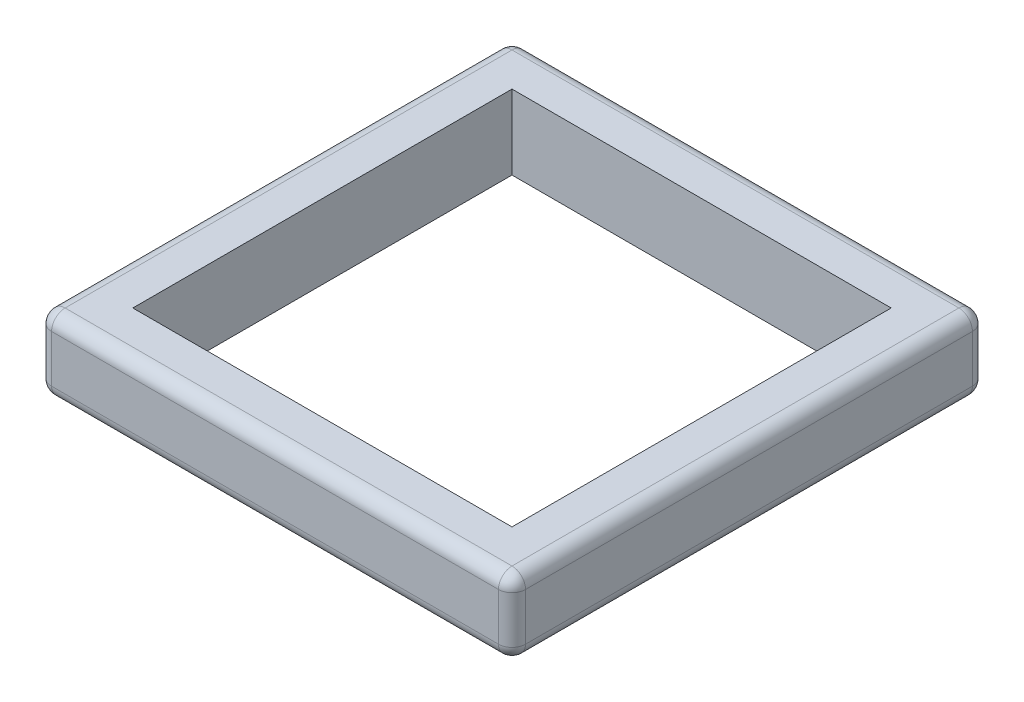
ISO-10303-21;
HEADER;
FILE_DESCRIPTION(('STEP AP214'),'2;1');
FILE_NAME('part.step','',(''),(''),'','','');
FILE_SCHEMA(('AUTOMOTIVE_DESIGN { 1 0 10303 214 1 1 1 1 }'));
ENDSEC;
DATA;
#1=APPLICATION_CONTEXT('core data for automotive mechanical design processes');
#2=APPLICATION_PROTOCOL_DEFINITION('international standard','automotive_design',2000,#1);
#3=PRODUCT_CONTEXT('',#1,'mechanical');
#4=PRODUCT('Part','Part','',(#3));
#5=PRODUCT_RELATED_PRODUCT_CATEGORY('part','',(#4));
#6=PRODUCT_DEFINITION_FORMATION('','',#4);
#7=PRODUCT_DEFINITION_CONTEXT('part definition',#1,'design');
#8=PRODUCT_DEFINITION('design','',#6,#7);
#9=PRODUCT_DEFINITION_SHAPE('','',#8);
#10=(LENGTH_UNIT() NAMED_UNIT(*) SI_UNIT(.MILLI.,.METRE.));
#11=(NAMED_UNIT(*) PLANE_ANGLE_UNIT() SI_UNIT($,.RADIAN.));
#12=(NAMED_UNIT(*) SI_UNIT($,.STERADIAN.) SOLID_ANGLE_UNIT());
#13=UNCERTAINTY_MEASURE_WITH_UNIT(LENGTH_MEASURE(1.E-05),#10,'distance_accuracy_value','');
#14=(GEOMETRIC_REPRESENTATION_CONTEXT(3) GLOBAL_UNCERTAINTY_ASSIGNED_CONTEXT((#13)) GLOBAL_UNIT_ASSIGNED_CONTEXT((#10,
#11,#12)) REPRESENTATION_CONTEXT('',''));
#15=CARTESIAN_POINT('',(0.,0.,0.));
#16=DIRECTION('',(0.,0.,1.));
#17=DIRECTION('',(1.,0.,0.));
#18=AXIS2_PLACEMENT_3D('',#15,#16,#17);
#19=CARTESIAN_POINT('',(0.,139.7,0.));
#20=DIRECTION('',(0.,-1.,0.));
#21=DIRECTION('',(0.,0.,-1.));
#22=AXIS2_PLACEMENT_3D('',#19,#20,#21);
#23=PLANE('',#22);
#24=DIRECTION('',(-1.,0.,0.));
#25=VECTOR('',#24,1.);
#26=CARTESIAN_POINT('',(0.,139.7,-397.944050632912));
#27=LINE('',#26,#25);
#28=CARTESIAN_POINT('',(380.389113924051,139.7,-397.944050632912));
#29=VERTEX_POINT('',#28);
#30=CARTESIAN_POINT('',(-457.810886075949,139.7,-397.944050632912));
#31=VERTEX_POINT('',#30);
#32=EDGE_CURVE('E53',#29,#31,#27,.T.);
#33=ORIENTED_EDGE('',*,*,#32,.T.);
#34=DIRECTION('',(0.,0.,1.));
#35=VECTOR('',#34,1.);
#36=CARTESIAN_POINT('',(-457.810886075949,139.7,0.));
#37=LINE('',#36,#35);
#38=CARTESIAN_POINT('',(-457.810886075949,139.7,440.255949367088));
#39=VERTEX_POINT('',#38);
#40=EDGE_CURVE('E11',#31,#39,#37,.T.);
#41=ORIENTED_EDGE('',*,*,#40,.T.);
#42=DIRECTION('',(1.,0.,0.));
#43=VECTOR('',#42,1.);
#44=CARTESIAN_POINT('',(0.,139.7,440.255949367088));
#45=LINE('',#44,#43);
#46=CARTESIAN_POINT('',(380.389113924051,139.7,440.255949367088));
#47=VERTEX_POINT('',#46);
#48=EDGE_CURVE('E274',#39,#47,#45,.T.);
#49=ORIENTED_EDGE('',*,*,#48,.T.);
#50=DIRECTION('',(0.,0.,-1.));
#51=VECTOR('',#50,1.);
#52=CARTESIAN_POINT('',(380.389113924051,139.7,0.));
#53=LINE('',#52,#51);
#54=EDGE_CURVE('E64',#47,#29,#53,.T.);
#55=ORIENTED_EDGE('',*,*,#54,.T.);
#56=EDGE_LOOP('',(#33,#41,#49,#55));
#57=FACE_BOUND('',#56,.T.);
#58=DIRECTION('',(0.,0.,-1.));
#59=VECTOR('',#58,1.);
#60=CARTESIAN_POINT('',(316.889113924051,139.7,376.755949367088));
#61=LINE('',#60,#59);
#62=CARTESIAN_POINT('',(316.889113924051,139.7,376.755949367088));
#63=VERTEX_POINT('',#62);
#64=CARTESIAN_POINT('',(316.889113924051,139.7,-334.444050632912));
#65=VERTEX_POINT('',#64);
#66=EDGE_CURVE('E157',#63,#65,#61,.T.);
#67=ORIENTED_EDGE('',*,*,#66,.F.);
#68=DIRECTION('',(1.,0.,0.));
#69=VECTOR('',#68,1.);
#70=CARTESIAN_POINT('',(-394.310886075949,139.7,376.755949367088));
#71=LINE('',#70,#69);
#72=CARTESIAN_POINT('',(-394.310886075949,139.7,376.755949367088));
#73=VERTEX_POINT('',#72);
#74=EDGE_CURVE('E186',#73,#63,#71,.T.);
#75=ORIENTED_EDGE('',*,*,#74,.F.);
#76=DIRECTION('',(0.,0.,1.));
#77=VECTOR('',#76,1.);
#78=CARTESIAN_POINT('',(-394.310886075949,139.7,376.755949367088));
#79=LINE('',#78,#77);
#80=CARTESIAN_POINT('',(-394.310886075949,139.7,-334.444050632912));
#81=VERTEX_POINT('',#80);
#82=EDGE_CURVE('E182',#81,#73,#79,.T.);
#83=ORIENTED_EDGE('',*,*,#82,.F.);
#84=DIRECTION('',(-1.,0.,0.));
#85=VECTOR('',#84,1.);
#86=CARTESIAN_POINT('',(-394.310886075949,139.7,-334.444050632912));
#87=LINE('',#86,#85);
#88=EDGE_CURVE('E168',#65,#81,#87,.T.);
#89=ORIENTED_EDGE('',*,*,#88,.F.);
#90=EDGE_LOOP('',(#67,#75,#83,#89));
#91=FACE_BOUND('',#90,.T.);
#92=ADVANCED_FACE('F43',(#57,#91),#23,.F.);
#93=CARTESIAN_POINT('',(0.,0.,0.));
#94=DIRECTION('',(0.,-1.,0.));
#95=DIRECTION('',(0.,0.,-1.));
#96=AXIS2_PLACEMENT_3D('',#93,#94,#95);
#97=PLANE('',#96);
#98=DIRECTION('',(1.,0.,0.));
#99=VECTOR('',#98,1.);
#100=CARTESIAN_POINT('',(-483.210886075949,0.,440.255949367088));
#101=LINE('',#100,#99);
#102=CARTESIAN_POINT('',(380.389113924051,0.,440.255949367088));
#103=VERTEX_POINT('',#102);
#104=CARTESIAN_POINT('',(-457.810886075949,0.,440.255949367088));
#105=VERTEX_POINT('',#104);
#106=EDGE_CURVE('E264',#103,#105,#101,.F.);
#107=ORIENTED_EDGE('',*,*,#106,.T.);
#108=DIRECTION('',(0.,0.,1.));
#109=VECTOR('',#108,1.);
#110=CARTESIAN_POINT('',(-457.810886075949,0.,-423.344050632912));
#111=LINE('',#110,#109);
#112=CARTESIAN_POINT('',(-457.810886075949,0.,-397.944050632912));
#113=VERTEX_POINT('',#112);
#114=EDGE_CURVE('E270',#105,#113,#111,.F.);
#115=ORIENTED_EDGE('',*,*,#114,.T.);
#116=DIRECTION('',(-1.,0.,0.));
#117=VECTOR('',#116,1.);
#118=CARTESIAN_POINT('',(405.789113924051,0.,-397.944050632912));
#119=LINE('',#118,#117);
#120=CARTESIAN_POINT('',(380.389113924051,0.,-397.944050632912));
#121=VERTEX_POINT('',#120);
#122=EDGE_CURVE('E267',#113,#121,#119,.F.);
#123=ORIENTED_EDGE('',*,*,#122,.T.);
#124=DIRECTION('',(0.,0.,-1.));
#125=VECTOR('',#124,1.);
#126=CARTESIAN_POINT('',(380.389113924051,0.,465.655949367088));
#127=LINE('',#126,#125);
#128=EDGE_CURVE('E261',#121,#103,#127,.F.);
#129=ORIENTED_EDGE('',*,*,#128,.T.);
#130=EDGE_LOOP('',(#107,#115,#123,#129));
#131=FACE_BOUND('',#130,.T.);
#132=DIRECTION('',(1.,0.,0.));
#133=VECTOR('',#132,1.);
#134=CARTESIAN_POINT('',(-394.310886075949,0.,376.755949367088));
#135=LINE('',#134,#133);
#136=CARTESIAN_POINT('',(-394.310886075949,0.,376.755949367088));
#137=VERTEX_POINT('',#136);
#138=CARTESIAN_POINT('',(316.889113924051,0.,376.755949367088));
#139=VERTEX_POINT('',#138);
#140=EDGE_CURVE('E169',#137,#139,#135,.T.);
#141=ORIENTED_EDGE('',*,*,#140,.T.);
#142=DIRECTION('',(0.,0.,-1.));
#143=VECTOR('',#142,1.);
#144=CARTESIAN_POINT('',(316.889113924051,0.,376.755949367088));
#145=LINE('',#144,#143);
#146=CARTESIAN_POINT('',(316.889113924051,0.,-334.444050632912));
#147=VERTEX_POINT('',#146);
#148=EDGE_CURVE('E191',#139,#147,#145,.T.);
#149=ORIENTED_EDGE('',*,*,#148,.T.);
#150=DIRECTION('',(-1.,0.,0.));
#151=VECTOR('',#150,1.);
#152=CARTESIAN_POINT('',(-394.310886075949,0.,-334.444050632912));
#153=LINE('',#152,#151);
#154=CARTESIAN_POINT('',(-394.310886075949,0.,-334.444050632912));
#155=VERTEX_POINT('',#154);
#156=EDGE_CURVE('E175',#147,#155,#153,.T.);
#157=ORIENTED_EDGE('',*,*,#156,.T.);
#158=DIRECTION('',(0.,0.,1.));
#159=VECTOR('',#158,1.);
#160=CARTESIAN_POINT('',(-394.310886075949,0.,376.755949367088));
#161=LINE('',#160,#159);
#162=EDGE_CURVE('E196',#155,#137,#161,.T.);
#163=ORIENTED_EDGE('',*,*,#162,.T.);
#164=EDGE_LOOP('',(#141,#149,#157,#163));
#165=FACE_BOUND('',#164,.T.);
#166=ADVANCED_FACE('F448',(#131,#165),#97,.T.);
#167=CARTESIAN_POINT('',(405.789113924051,139.7,465.655949367088));
#168=DIRECTION('',(-1.,0.,0.));
#169=DIRECTION('',(0.,0.,1.));
#170=AXIS2_PLACEMENT_3D('',#167,#168,#169);
#171=PLANE('',#170);
#172=DIRECTION('',(0.,-1.,0.));
#173=VECTOR('',#172,1.);
#174=CARTESIAN_POINT('',(405.789113924051,139.7,440.255949367088));
#175=LINE('',#174,#173);
#176=CARTESIAN_POINT('',(405.789113924051,114.3,440.255949367088));
#177=VERTEX_POINT('',#176);
#178=CARTESIAN_POINT('',(405.789113924051,25.4,440.255949367088));
#179=VERTEX_POINT('',#178);
#180=EDGE_CURVE('E215',#177,#179,#175,.T.);
#181=ORIENTED_EDGE('',*,*,#180,.T.);
#182=DIRECTION('',(0.,0.,-1.));
#183=VECTOR('',#182,1.);
#184=CARTESIAN_POINT('',(405.789113924051,25.4,-423.344050632912));
#185=LINE('',#184,#183);
#186=CARTESIAN_POINT('',(405.789113924051,25.4,-397.944050632912));
#187=VERTEX_POINT('',#186);
#188=EDGE_CURVE('E219',#179,#187,#185,.T.);
#189=ORIENTED_EDGE('',*,*,#188,.T.);
#190=DIRECTION('',(0.,-1.,0.));
#191=VECTOR('',#190,1.);
#192=CARTESIAN_POINT('',(405.789113924051,139.7,-397.944050632912));
#193=LINE('',#192,#191);
#194=CARTESIAN_POINT('',(405.789113924051,114.3,-397.944050632912));
#195=VERTEX_POINT('',#194);
#196=EDGE_CURVE('E212',#187,#195,#193,.F.);
#197=ORIENTED_EDGE('',*,*,#196,.T.);
#198=DIRECTION('',(0.,0.,-1.));
#199=VECTOR('',#198,1.);
#200=CARTESIAN_POINT('',(405.789113924051,114.3,465.655949367088));
#201=LINE('',#200,#199);
#202=EDGE_CURVE('E177',#195,#177,#201,.F.);
#203=ORIENTED_EDGE('',*,*,#202,.T.);
#204=EDGE_LOOP('',(#181,#189,#197,#203));
#205=FACE_BOUND('',#204,.T.);
#206=ADVANCED_FACE('F405',(#205),#171,.F.);
#207=CARTESIAN_POINT('',(-483.210886075949,139.7,-423.344050632912));
#208=DIRECTION('',(0.,0.,1.));
#209=DIRECTION('',(1.,0.,0.));
#210=AXIS2_PLACEMENT_3D('',#207,#208,#209);
#211=PLANE('',#210);
#212=DIRECTION('',(0.,-1.,0.));
#213=VECTOR('',#212,1.);
#214=CARTESIAN_POINT('',(380.389113924051,139.7,-423.344050632912));
#215=LINE('',#214,#213);
#216=CARTESIAN_POINT('',(380.389113924051,114.3,-423.344050632912));
#217=VERTEX_POINT('',#216);
#218=CARTESIAN_POINT('',(380.389113924051,25.4,-423.344050632912));
#219=VERTEX_POINT('',#218);
#220=EDGE_CURVE('E254',#217,#219,#215,.T.);
#221=ORIENTED_EDGE('',*,*,#220,.T.);
#222=DIRECTION('',(-1.,0.,0.));
#223=VECTOR('',#222,1.);
#224=CARTESIAN_POINT('',(-483.210886075949,25.4,-423.344050632912));
#225=LINE('',#224,#223);
#226=CARTESIAN_POINT('',(-457.810886075949,25.4,-423.344050632912));
#227=VERTEX_POINT('',#226);
#228=EDGE_CURVE('E258',#219,#227,#225,.T.);
#229=ORIENTED_EDGE('',*,*,#228,.T.);
#230=DIRECTION('',(0.,-1.,0.));
#231=VECTOR('',#230,1.);
#232=CARTESIAN_POINT('',(-457.810886075949,139.7,-423.344050632912));
#233=LINE('',#232,#231);
#234=CARTESIAN_POINT('',(-457.810886075949,114.3,-423.344050632912));
#235=VERTEX_POINT('',#234);
#236=EDGE_CURVE('E251',#227,#235,#233,.F.);
#237=ORIENTED_EDGE('',*,*,#236,.T.);
#238=DIRECTION('',(-1.,0.,0.));
#239=VECTOR('',#238,1.);
#240=CARTESIAN_POINT('',(-483.210886075949,114.3,-423.344050632912));
#241=LINE('',#240,#239);
#242=EDGE_CURVE('E248',#235,#217,#241,.F.);
#243=ORIENTED_EDGE('',*,*,#242,.T.);
#244=EDGE_LOOP('',(#221,#229,#237,#243));
#245=FACE_BOUND('',#244,.T.);
#246=ADVANCED_FACE('F419',(#245),#211,.F.);
#247=CARTESIAN_POINT('',(-483.210886075949,139.7,465.655949367088));
#248=DIRECTION('',(1.,0.,0.));
#249=DIRECTION('',(0.,0.,-1.));
#250=AXIS2_PLACEMENT_3D('',#247,#248,#249);
#251=PLANE('',#250);
#252=DIRECTION('',(0.,-1.,0.));
#253=VECTOR('',#252,1.);
#254=CARTESIAN_POINT('',(-483.210886075949,139.7,-397.944050632912));
#255=LINE('',#254,#253);
#256=CARTESIAN_POINT('',(-483.210886075949,114.3,-397.944050632912));
#257=VERTEX_POINT('',#256);
#258=CARTESIAN_POINT('',(-483.210886075949,25.4,-397.944050632912));
#259=VERTEX_POINT('',#258);
#260=EDGE_CURVE('E238',#257,#259,#255,.T.);
#261=ORIENTED_EDGE('',*,*,#260,.T.);
#262=DIRECTION('',(0.,0.,1.));
#263=VECTOR('',#262,1.);
#264=CARTESIAN_POINT('',(-483.210886075949,25.4,465.655949367088));
#265=LINE('',#264,#263);
#266=CARTESIAN_POINT('',(-483.210886075949,25.4,440.255949367088));
#267=VERTEX_POINT('',#266);
#268=EDGE_CURVE('E245',#259,#267,#265,.T.);
#269=ORIENTED_EDGE('',*,*,#268,.T.);
#270=DIRECTION('',(0.,-1.,0.));
#271=VECTOR('',#270,1.);
#272=CARTESIAN_POINT('',(-483.210886075949,139.7,440.255949367088));
#273=LINE('',#272,#271);
#274=CARTESIAN_POINT('',(-483.210886075949,114.3,440.255949367088));
#275=VERTEX_POINT('',#274);
#276=EDGE_CURVE('E241',#267,#275,#273,.F.);
#277=ORIENTED_EDGE('',*,*,#276,.T.);
#278=DIRECTION('',(0.,0.,1.));
#279=VECTOR('',#278,1.);
#280=CARTESIAN_POINT('',(-483.210886075949,114.3,465.655949367088));
#281=LINE('',#280,#279);
#282=EDGE_CURVE('E235',#275,#257,#281,.F.);
#283=ORIENTED_EDGE('',*,*,#282,.T.);
#284=EDGE_LOOP('',(#261,#269,#277,#283));
#285=FACE_BOUND('',#284,.T.);
#286=ADVANCED_FACE('F429',(#285),#251,.F.);
#287=CARTESIAN_POINT('',(-483.210886075949,139.7,465.655949367088));
#288=DIRECTION('',(0.,0.,-1.));
#289=DIRECTION('',(-1.,0.,0.));
#290=AXIS2_PLACEMENT_3D('',#287,#288,#289);
#291=PLANE('',#290);
#292=DIRECTION('',(0.,-1.,0.));
#293=VECTOR('',#292,1.);
#294=CARTESIAN_POINT('',(-457.810886075949,139.7,465.655949367088));
#295=LINE('',#294,#293);
#296=CARTESIAN_POINT('',(-457.810886075949,114.3,465.655949367088));
#297=VERTEX_POINT('',#296);
#298=CARTESIAN_POINT('',(-457.810886075949,25.4,465.655949367088));
#299=VERTEX_POINT('',#298);
#300=EDGE_CURVE('E225',#297,#299,#295,.T.);
#301=ORIENTED_EDGE('',*,*,#300,.T.);
#302=DIRECTION('',(1.,0.,0.));
#303=VECTOR('',#302,1.);
#304=CARTESIAN_POINT('',(405.789113924051,25.4,465.655949367088));
#305=LINE('',#304,#303);
#306=CARTESIAN_POINT('',(380.389113924051,25.4,465.655949367088));
#307=VERTEX_POINT('',#306);
#308=EDGE_CURVE('E232',#299,#307,#305,.T.);
#309=ORIENTED_EDGE('',*,*,#308,.T.);
#310=DIRECTION('',(0.,-1.,0.));
#311=VECTOR('',#310,1.);
#312=CARTESIAN_POINT('',(380.389113924051,139.7,465.655949367088));
#313=LINE('',#312,#311);
#314=CARTESIAN_POINT('',(380.389113924051,114.3,465.655949367088));
#315=VERTEX_POINT('',#314);
#316=EDGE_CURVE('E228',#307,#315,#313,.F.);
#317=ORIENTED_EDGE('',*,*,#316,.T.);
#318=DIRECTION('',(1.,0.,0.));
#319=VECTOR('',#318,1.);
#320=CARTESIAN_POINT('',(-483.210886075949,114.3,465.655949367088));
#321=LINE('',#320,#319);
#322=EDGE_CURVE('E222',#315,#297,#321,.F.);
#323=ORIENTED_EDGE('',*,*,#322,.T.);
#324=EDGE_LOOP('',(#301,#309,#317,#323));
#325=FACE_BOUND('',#324,.T.);
#326=ADVANCED_FACE('F458',(#325),#291,.F.);
#327=CARTESIAN_POINT('',(316.889113924051,139.7,376.755949367088));
#328=DIRECTION('',(-1.,0.,0.));
#329=DIRECTION('',(0.,0.,1.));
#330=AXIS2_PLACEMENT_3D('',#327,#328,#329);
#331=PLANE('',#330);
#332=ORIENTED_EDGE('',*,*,#148,.F.);
#333=DIRECTION('',(0.,-1.,0.));
#334=VECTOR('',#333,1.);
#335=CARTESIAN_POINT('',(316.889113924051,139.7,376.755949367088));
#336=LINE('',#335,#334);
#337=EDGE_CURVE('E163',#63,#139,#336,.T.);
#338=ORIENTED_EDGE('',*,*,#337,.F.);
#339=ORIENTED_EDGE('',*,*,#66,.T.);
#340=DIRECTION('',(0.,-1.,0.));
#341=VECTOR('',#340,1.);
#342=CARTESIAN_POINT('',(316.889113924051,139.7,-334.444050632912));
#343=LINE('',#342,#341);
#344=EDGE_CURVE('E160',#65,#147,#343,.T.);
#345=ORIENTED_EDGE('',*,*,#344,.T.);
#346=EDGE_LOOP('',(#332,#338,#339,#345));
#347=FACE_BOUND('',#346,.T.);
#348=ADVANCED_FACE('F159',(#347),#331,.T.);
#349=CARTESIAN_POINT('',(-394.310886075949,139.7,-334.444050632912));
#350=DIRECTION('',(0.,0.,1.));
#351=DIRECTION('',(1.,0.,0.));
#352=AXIS2_PLACEMENT_3D('',#349,#350,#351);
#353=PLANE('',#352);
#354=ORIENTED_EDGE('',*,*,#156,.F.);
#355=ORIENTED_EDGE('',*,*,#344,.F.);
#356=ORIENTED_EDGE('',*,*,#88,.T.);
#357=DIRECTION('',(0.,-1.,0.));
#358=VECTOR('',#357,1.);
#359=CARTESIAN_POINT('',(-394.310886075949,139.7,-334.444050632912));
#360=LINE('',#359,#358);
#361=EDGE_CURVE('E178',#81,#155,#360,.T.);
#362=ORIENTED_EDGE('',*,*,#361,.T.);
#363=EDGE_LOOP('',(#354,#355,#356,#362));
#364=FACE_BOUND('',#363,.T.);
#365=ADVANCED_FACE('F172',(#364),#353,.T.);
#366=CARTESIAN_POINT('',(-394.310886075949,139.7,376.755949367088));
#367=DIRECTION('',(1.,0.,0.));
#368=DIRECTION('',(0.,0.,-1.));
#369=AXIS2_PLACEMENT_3D('',#366,#367,#368);
#370=PLANE('',#369);
#371=ORIENTED_EDGE('',*,*,#162,.F.);
#372=ORIENTED_EDGE('',*,*,#361,.F.);
#373=ORIENTED_EDGE('',*,*,#82,.T.);
#374=DIRECTION('',(0.,-1.,0.));
#375=VECTOR('',#374,1.);
#376=CARTESIAN_POINT('',(-394.310886075949,139.7,376.755949367088));
#377=LINE('',#376,#375);
#378=EDGE_CURVE('E205',#73,#137,#377,.T.);
#379=ORIENTED_EDGE('',*,*,#378,.T.);
#380=EDGE_LOOP('',(#371,#372,#373,#379));
#381=FACE_BOUND('',#380,.T.);
#382=ADVANCED_FACE('F511',(#381),#370,.T.);
#383=CARTESIAN_POINT('',(-394.310886075949,139.7,376.755949367088));
#384=DIRECTION('',(0.,0.,-1.));
#385=DIRECTION('',(-1.,0.,0.));
#386=AXIS2_PLACEMENT_3D('',#383,#384,#385);
#387=PLANE('',#386);
#388=ORIENTED_EDGE('',*,*,#140,.F.);
#389=ORIENTED_EDGE('',*,*,#378,.F.);
#390=ORIENTED_EDGE('',*,*,#74,.T.);
#391=ORIENTED_EDGE('',*,*,#337,.T.);
#392=EDGE_LOOP('',(#388,#389,#390,#391));
#393=FACE_BOUND('',#392,.T.);
#394=ADVANCED_FACE('F509',(#393),#387,.T.);
#395=CARTESIAN_POINT('',(-457.810886075949,139.7,-397.944050632912));
#396=DIRECTION('',(0.,-1.,0.));
#397=DIRECTION('',(0.,0.,-1.));
#398=AXIS2_PLACEMENT_3D('',#395,#396,#397);
#399=CYLINDRICAL_SURFACE('',#398,25.4);
#400=CARTESIAN_POINT('',(-457.810886075949,114.3,-397.944050632912));
#401=DIRECTION('',(0.,1.,0.));
#402=DIRECTION('',(0.,0.,1.));
#403=AXIS2_PLACEMENT_3D('',#400,#401,#402);
#404=CIRCLE('',#403,25.4);
#405=EDGE_CURVE('E47',#235,#257,#404,.T.);
#406=ORIENTED_EDGE('',*,*,#405,.F.);
#407=ORIENTED_EDGE('',*,*,#236,.F.);
#408=CARTESIAN_POINT('',(-457.810886075949,25.4,-397.944050632912));
#409=DIRECTION('',(0.,-1.,0.));
#410=DIRECTION('',(0.,0.,-1.));
#411=AXIS2_PLACEMENT_3D('',#408,#409,#410);
#412=CIRCLE('',#411,25.4);
#413=EDGE_CURVE('E363',#259,#227,#412,.T.);
#414=ORIENTED_EDGE('',*,*,#413,.F.);
#415=ORIENTED_EDGE('',*,*,#260,.F.);
#416=EDGE_LOOP('',(#406,#407,#414,#415));
#417=FACE_BOUND('',#416,.T.);
#418=ADVANCED_FACE('F45',(#417),#399,.T.);
#419=CARTESIAN_POINT('',(-457.810886075949,114.3,-397.944050632912));
#420=DIRECTION('',(-1.,0.,0.));
#421=DIRECTION('',(0.,0.,1.));
#422=AXIS2_PLACEMENT_3D('',#419,#420,#421);
#423=SPHERICAL_SURFACE('',#422,25.4);
#424=CARTESIAN_POINT('',(-457.810886075949,114.3,-397.944050632912));
#425=DIRECTION('',(-1.,0.,0.));
#426=DIRECTION('',(0.,0.,1.));
#427=AXIS2_PLACEMENT_3D('',#424,#425,#426);
#428=CIRCLE('',#427,25.4);
#429=EDGE_CURVE('E357',#235,#31,#428,.F.);
#430=ORIENTED_EDGE('',*,*,#429,.F.);
#431=ORIENTED_EDGE('',*,*,#405,.T.);
#432=CARTESIAN_POINT('',(-457.810886075949,114.3,-397.944050632912));
#433=DIRECTION('',(0.,0.,-1.));
#434=DIRECTION('',(-1.,0.,0.));
#435=AXIS2_PLACEMENT_3D('',#432,#433,#434);
#436=CIRCLE('',#435,25.4);
#437=EDGE_CURVE('E360',#31,#257,#436,.F.);
#438=ORIENTED_EDGE('',*,*,#437,.F.);
#439=EDGE_LOOP('',(#430,#431,#438));
#440=FACE_BOUND('',#439,.T.);
#441=ADVANCED_FACE('F376',(#440),#423,.T.);
#442=CARTESIAN_POINT('',(-457.810886075949,25.4,-397.944050632912));
#443=DIRECTION('',(0.,0.,-1.));
#444=DIRECTION('',(0.,1.,0.));
#445=AXIS2_PLACEMENT_3D('',#442,#443,#444);
#446=SPHERICAL_SURFACE('',#445,25.4);
#447=CARTESIAN_POINT('',(-457.810886075949,25.4,-397.944050632912));
#448=DIRECTION('',(0.,0.,-1.));
#449=DIRECTION('',(-1.,0.,0.));
#450=AXIS2_PLACEMENT_3D('',#447,#448,#449);
#451=CIRCLE('',#450,25.4);
#452=EDGE_CURVE('E349',#259,#113,#451,.F.);
#453=ORIENTED_EDGE('',*,*,#452,.F.);
#454=ORIENTED_EDGE('',*,*,#413,.T.);
#455=CARTESIAN_POINT('',(-457.810886075949,25.4,-397.944050632912));
#456=DIRECTION('',(-1.,0.,0.));
#457=DIRECTION('',(0.,0.,1.));
#458=AXIS2_PLACEMENT_3D('',#455,#456,#457);
#459=CIRCLE('',#458,25.4);
#460=EDGE_CURVE('E353',#113,#227,#459,.F.);
#461=ORIENTED_EDGE('',*,*,#460,.F.);
#462=EDGE_LOOP('',(#453,#454,#461));
#463=FACE_BOUND('',#462,.T.);
#464=ADVANCED_FACE('F422',(#463),#446,.T.);
#465=CARTESIAN_POINT('',(-457.810886075949,114.3,0.));
#466=DIRECTION('',(0.,0.,1.));
#467=DIRECTION('',(1.,0.,0.));
#468=AXIS2_PLACEMENT_3D('',#465,#466,#467);
#469=CYLINDRICAL_SURFACE('',#468,25.4);
#470=ORIENTED_EDGE('',*,*,#437,.T.);
#471=ORIENTED_EDGE('',*,*,#282,.F.);
#472=CARTESIAN_POINT('',(-457.810886075949,114.3,440.255949367088));
#473=DIRECTION('',(0.,0.,1.));
#474=DIRECTION('',(1.,0.,0.));
#475=AXIS2_PLACEMENT_3D('',#472,#473,#474);
#476=CIRCLE('',#475,25.4);
#477=EDGE_CURVE('E342',#39,#275,#476,.T.);
#478=ORIENTED_EDGE('',*,*,#477,.F.);
#479=ORIENTED_EDGE('',*,*,#40,.F.);
#480=EDGE_LOOP('',(#470,#471,#478,#479));
#481=FACE_BOUND('',#480,.T.);
#482=ADVANCED_FACE('F384',(#481),#469,.T.);
#483=CARTESIAN_POINT('',(0.,114.3,-397.944050632912));
#484=DIRECTION('',(-1.,0.,0.));
#485=DIRECTION('',(0.,0.,1.));
#486=AXIS2_PLACEMENT_3D('',#483,#484,#485);
#487=CYLINDRICAL_SURFACE('',#486,25.4);
#488=ORIENTED_EDGE('',*,*,#429,.T.);
#489=ORIENTED_EDGE('',*,*,#32,.F.);
#490=CARTESIAN_POINT('',(380.389113924051,114.3,-397.944050632912));
#491=DIRECTION('',(1.,0.,0.));
#492=DIRECTION('',(0.,1.,0.));
#493=AXIS2_PLACEMENT_3D('',#490,#491,#492);
#494=CIRCLE('',#493,25.4);
#495=EDGE_CURVE('E338',#217,#29,#494,.T.);
#496=ORIENTED_EDGE('',*,*,#495,.F.);
#497=ORIENTED_EDGE('',*,*,#242,.F.);
#498=EDGE_LOOP('',(#488,#489,#496,#497));
#499=FACE_BOUND('',#498,.T.);
#500=ADVANCED_FACE('F417',(#499),#487,.T.);
#501=CARTESIAN_POINT('',(380.389113924051,139.7,-397.944050632912));
#502=DIRECTION('',(0.,-1.,0.));
#503=DIRECTION('',(0.,0.,-1.));
#504=AXIS2_PLACEMENT_3D('',#501,#502,#503);
#505=CYLINDRICAL_SURFACE('',#504,25.4);
#506=CARTESIAN_POINT('',(380.389113924051,25.4,-397.944050632912));
#507=DIRECTION('',(0.,-1.,0.));
#508=DIRECTION('',(0.,0.,-1.));
#509=AXIS2_PLACEMENT_3D('',#506,#507,#508);
#510=CIRCLE('',#509,25.4);
#511=EDGE_CURVE('E330',#219,#187,#510,.T.);
#512=ORIENTED_EDGE('',*,*,#511,.F.);
#513=ORIENTED_EDGE('',*,*,#220,.F.);
#514=CARTESIAN_POINT('',(380.389113924051,114.3,-397.944050632912));
#515=DIRECTION('',(0.,1.,0.));
#516=DIRECTION('',(0.,0.,1.));
#517=AXIS2_PLACEMENT_3D('',#514,#515,#516);
#518=CIRCLE('',#517,25.4);
#519=EDGE_CURVE('E334',#195,#217,#518,.T.);
#520=ORIENTED_EDGE('',*,*,#519,.F.);
#521=ORIENTED_EDGE('',*,*,#196,.F.);
#522=EDGE_LOOP('',(#512,#513,#520,#521));
#523=FACE_BOUND('',#522,.T.);
#524=ADVANCED_FACE('F412',(#523),#505,.T.);
#525=CARTESIAN_POINT('',(-483.210886075949,25.4,-397.944050632912));
#526=DIRECTION('',(1.,0.,0.));
#527=DIRECTION('',(0.,0.,-1.));
#528=AXIS2_PLACEMENT_3D('',#525,#526,#527);
#529=CYLINDRICAL_SURFACE('',#528,25.4);
#530=ORIENTED_EDGE('',*,*,#460,.T.);
#531=ORIENTED_EDGE('',*,*,#228,.F.);
#532=CARTESIAN_POINT('',(380.389113924051,25.4,-397.944050632912));
#533=DIRECTION('',(1.,0.,0.));
#534=DIRECTION('',(0.,0.,-1.));
#535=AXIS2_PLACEMENT_3D('',#532,#533,#534);
#536=CIRCLE('',#535,25.4);
#537=EDGE_CURVE('E327',#121,#219,#536,.T.);
#538=ORIENTED_EDGE('',*,*,#537,.F.);
#539=ORIENTED_EDGE('',*,*,#122,.F.);
#540=EDGE_LOOP('',(#530,#531,#538,#539));
#541=FACE_BOUND('',#540,.T.);
#542=ADVANCED_FACE('F500',(#541),#529,.T.);
#543=CARTESIAN_POINT('',(-457.810886075949,25.4,465.655949367088));
#544=DIRECTION('',(0.,0.,-1.));
#545=DIRECTION('',(-1.,0.,0.));
#546=AXIS2_PLACEMENT_3D('',#543,#544,#545);
#547=CYLINDRICAL_SURFACE('',#546,25.4);
#548=ORIENTED_EDGE('',*,*,#452,.T.);
#549=ORIENTED_EDGE('',*,*,#114,.F.);
#550=CARTESIAN_POINT('',(-457.810886075949,25.4,440.255949367088));
#551=DIRECTION('',(0.,0.,1.));
#552=DIRECTION('',(1.,0.,0.));
#553=AXIS2_PLACEMENT_3D('',#550,#551,#552);
#554=CIRCLE('',#553,25.4);
#555=EDGE_CURVE('E323',#267,#105,#554,.T.);
#556=ORIENTED_EDGE('',*,*,#555,.F.);
#557=ORIENTED_EDGE('',*,*,#268,.F.);
#558=EDGE_LOOP('',(#548,#549,#556,#557));
#559=FACE_BOUND('',#558,.T.);
#560=ADVANCED_FACE('F426',(#559),#547,.T.);
#561=CARTESIAN_POINT('',(-457.810886075949,139.7,440.255949367088));
#562=DIRECTION('',(0.,-1.,0.));
#563=DIRECTION('',(0.,0.,-1.));
#564=AXIS2_PLACEMENT_3D('',#561,#562,#563);
#565=CYLINDRICAL_SURFACE('',#564,25.4);
#566=CARTESIAN_POINT('',(-457.810886075949,114.3,440.255949367088));
#567=DIRECTION('',(0.,1.,0.));
#568=DIRECTION('',(0.,0.,1.));
#569=AXIS2_PLACEMENT_3D('',#566,#567,#568);
#570=CIRCLE('',#569,25.4);
#571=EDGE_CURVE('E345',#275,#297,#570,.T.);
#572=ORIENTED_EDGE('',*,*,#571,.F.);
#573=ORIENTED_EDGE('',*,*,#276,.F.);
#574=CARTESIAN_POINT('',(-457.810886075949,25.4,440.255949367088));
#575=DIRECTION('',(0.,-1.,0.));
#576=DIRECTION('',(0.,0.,-1.));
#577=AXIS2_PLACEMENT_3D('',#574,#575,#576);
#578=CIRCLE('',#577,25.4);
#579=EDGE_CURVE('E319',#299,#267,#578,.T.);
#580=ORIENTED_EDGE('',*,*,#579,.F.);
#581=ORIENTED_EDGE('',*,*,#300,.F.);
#582=EDGE_LOOP('',(#572,#573,#580,#581));
#583=FACE_BOUND('',#582,.T.);
#584=ADVANCED_FACE('F433',(#583),#565,.T.);
#585=CARTESIAN_POINT('',(-457.810886075949,114.3,440.255949367088));
#586=DIRECTION('',(-1.,0.,0.));
#587=DIRECTION('',(0.,0.,1.));
#588=AXIS2_PLACEMENT_3D('',#585,#586,#587);
#589=SPHERICAL_SURFACE('',#588,25.4);
#590=ORIENTED_EDGE('',*,*,#477,.T.);
#591=ORIENTED_EDGE('',*,*,#571,.T.);
#592=CARTESIAN_POINT('',(-457.810886075949,114.3,440.255949367088));
#593=DIRECTION('',(-1.,0.,0.));
#594=DIRECTION('',(0.,0.,1.));
#595=AXIS2_PLACEMENT_3D('',#592,#593,#594);
#596=CIRCLE('',#595,25.4);
#597=EDGE_CURVE('E315',#39,#297,#596,.F.);
#598=ORIENTED_EDGE('',*,*,#597,.F.);
#599=EDGE_LOOP('',(#590,#591,#598));
#600=FACE_BOUND('',#599,.T.);
#601=ADVANCED_FACE('F437',(#600),#589,.T.);
#602=CARTESIAN_POINT('',(380.389113924051,114.3,-397.944050632912));
#603=DIRECTION('',(0.,0.,-1.));
#604=DIRECTION('',(-1.,0.,0.));
#605=AXIS2_PLACEMENT_3D('',#602,#603,#604);
#606=SPHERICAL_SURFACE('',#605,25.4);
#607=ORIENTED_EDGE('',*,*,#519,.T.);
#608=ORIENTED_EDGE('',*,*,#495,.T.);
#609=CARTESIAN_POINT('',(380.389113924051,114.3,-397.944050632912));
#610=DIRECTION('',(0.,0.,-1.));
#611=DIRECTION('',(-1.,0.,0.));
#612=AXIS2_PLACEMENT_3D('',#609,#610,#611);
#613=CIRCLE('',#612,25.4);
#614=EDGE_CURVE('E311',#195,#29,#613,.F.);
#615=ORIENTED_EDGE('',*,*,#614,.F.);
#616=EDGE_LOOP('',(#607,#608,#615));
#617=FACE_BOUND('',#616,.T.);
#618=ADVANCED_FACE('F415',(#617),#606,.T.);
#619=CARTESIAN_POINT('',(380.389113924051,25.4,-397.944050632912));
#620=DIRECTION('',(0.,0.,-1.));
#621=DIRECTION('',(-1.,0.,0.));
#622=AXIS2_PLACEMENT_3D('',#619,#620,#621);
#623=SPHERICAL_SURFACE('',#622,25.4);
#624=ORIENTED_EDGE('',*,*,#537,.T.);
#625=ORIENTED_EDGE('',*,*,#511,.T.);
#626=CARTESIAN_POINT('',(380.389113924051,25.4,-397.944050632912));
#627=DIRECTION('',(0.,0.,-1.));
#628=DIRECTION('',(-1.,0.,0.));
#629=AXIS2_PLACEMENT_3D('',#626,#627,#628);
#630=CIRCLE('',#629,25.4);
#631=EDGE_CURVE('E307',#121,#187,#630,.F.);
#632=ORIENTED_EDGE('',*,*,#631,.F.);
#633=EDGE_LOOP('',(#624,#625,#632));
#634=FACE_BOUND('',#633,.T.);
#635=ADVANCED_FACE('F444',(#634),#623,.T.);
#636=CARTESIAN_POINT('',(-457.810886075949,25.4,440.255949367088));
#637=DIRECTION('',(-1.,0.,0.));
#638=DIRECTION('',(0.,-1.,0.));
#639=AXIS2_PLACEMENT_3D('',#636,#637,#638);
#640=SPHERICAL_SURFACE('',#639,25.4);
#641=ORIENTED_EDGE('',*,*,#579,.T.);
#642=ORIENTED_EDGE('',*,*,#555,.T.);
#643=CARTESIAN_POINT('',(-457.810886075949,25.4,440.255949367088));
#644=DIRECTION('',(-1.,0.,0.));
#645=DIRECTION('',(0.,0.,1.));
#646=AXIS2_PLACEMENT_3D('',#643,#644,#645);
#647=CIRCLE('',#646,25.4);
#648=EDGE_CURVE('E303',#299,#105,#647,.F.);
#649=ORIENTED_EDGE('',*,*,#648,.F.);
#650=EDGE_LOOP('',(#641,#642,#649));
#651=FACE_BOUND('',#650,.T.);
#652=ADVANCED_FACE('F488',(#651),#640,.T.);
#653=CARTESIAN_POINT('',(0.,114.3,440.255949367088));
#654=DIRECTION('',(1.,0.,0.));
#655=DIRECTION('',(0.,0.,-1.));
#656=AXIS2_PLACEMENT_3D('',#653,#654,#655);
#657=CYLINDRICAL_SURFACE('',#656,25.4);
#658=ORIENTED_EDGE('',*,*,#597,.T.);
#659=ORIENTED_EDGE('',*,*,#322,.F.);
#660=CARTESIAN_POINT('',(380.389113924051,114.3,440.255949367088));
#661=DIRECTION('',(1.,0.,0.));
#662=DIRECTION('',(0.,0.,-1.));
#663=AXIS2_PLACEMENT_3D('',#660,#661,#662);
#664=CIRCLE('',#663,25.4);
#665=EDGE_CURVE('E299',#47,#315,#664,.T.);
#666=ORIENTED_EDGE('',*,*,#665,.F.);
#667=ORIENTED_EDGE('',*,*,#48,.F.);
#668=EDGE_LOOP('',(#658,#659,#666,#667));
#669=FACE_BOUND('',#668,.T.);
#670=ADVANCED_FACE('F396',(#669),#657,.T.);
#671=CARTESIAN_POINT('',(380.389113924051,114.3,0.));
#672=DIRECTION('',(0.,0.,-1.));
#673=DIRECTION('',(-1.,0.,0.));
#674=AXIS2_PLACEMENT_3D('',#671,#672,#673);
#675=CYLINDRICAL_SURFACE('',#674,25.4);
#676=ORIENTED_EDGE('',*,*,#614,.T.);
#677=ORIENTED_EDGE('',*,*,#54,.F.);
#678=CARTESIAN_POINT('',(380.389113924051,114.3,440.255949367088));
#679=DIRECTION('',(0.,0.,1.));
#680=DIRECTION('',(1.,0.,0.));
#681=AXIS2_PLACEMENT_3D('',#678,#679,#680);
#682=CIRCLE('',#681,25.4);
#683=EDGE_CURVE('E295',#177,#47,#682,.T.);
#684=ORIENTED_EDGE('',*,*,#683,.F.);
#685=ORIENTED_EDGE('',*,*,#202,.F.);
#686=EDGE_LOOP('',(#676,#677,#684,#685));
#687=FACE_BOUND('',#686,.T.);
#688=ADVANCED_FACE('F391',(#687),#675,.T.);
#689=CARTESIAN_POINT('',(380.389113924051,25.4,465.655949367088));
#690=DIRECTION('',(0.,0.,1.));
#691=DIRECTION('',(1.,0.,0.));
#692=AXIS2_PLACEMENT_3D('',#689,#690,#691);
#693=CYLINDRICAL_SURFACE('',#692,25.4);
#694=ORIENTED_EDGE('',*,*,#631,.T.);
#695=ORIENTED_EDGE('',*,*,#188,.F.);
#696=CARTESIAN_POINT('',(380.389113924051,25.4,440.255949367088));
#697=DIRECTION('',(0.,0.,1.));
#698=DIRECTION('',(1.,0.,0.));
#699=AXIS2_PLACEMENT_3D('',#696,#697,#698);
#700=CIRCLE('',#699,25.4);
#701=EDGE_CURVE('E291',#103,#179,#700,.T.);
#702=ORIENTED_EDGE('',*,*,#701,.F.);
#703=ORIENTED_EDGE('',*,*,#128,.F.);
#704=EDGE_LOOP('',(#694,#695,#702,#703));
#705=FACE_BOUND('',#704,.T.);
#706=ADVANCED_FACE('F479',(#705),#693,.T.);
#707=CARTESIAN_POINT('',(-483.210886075949,25.4,440.255949367088));
#708=DIRECTION('',(-1.,0.,0.));
#709=DIRECTION('',(0.,0.,1.));
#710=AXIS2_PLACEMENT_3D('',#707,#708,#709);
#711=CYLINDRICAL_SURFACE('',#710,25.4);
#712=ORIENTED_EDGE('',*,*,#648,.T.);
#713=ORIENTED_EDGE('',*,*,#106,.F.);
#714=CARTESIAN_POINT('',(380.389113924051,25.4,440.255949367088));
#715=DIRECTION('',(1.,0.,0.));
#716=DIRECTION('',(0.,0.,-1.));
#717=AXIS2_PLACEMENT_3D('',#714,#715,#716);
#718=CIRCLE('',#717,25.4);
#719=EDGE_CURVE('E287',#307,#103,#718,.T.);
#720=ORIENTED_EDGE('',*,*,#719,.F.);
#721=ORIENTED_EDGE('',*,*,#308,.F.);
#722=EDGE_LOOP('',(#712,#713,#720,#721));
#723=FACE_BOUND('',#722,.T.);
#724=ADVANCED_FACE('F476',(#723),#711,.T.);
#725=CARTESIAN_POINT('',(380.389113924051,114.3,440.255949367088));
#726=DIRECTION('',(0.,1.,0.));
#727=DIRECTION('',(0.,0.,1.));
#728=AXIS2_PLACEMENT_3D('',#725,#726,#727);
#729=SPHERICAL_SURFACE('',#728,25.4);
#730=ORIENTED_EDGE('',*,*,#683,.T.);
#731=ORIENTED_EDGE('',*,*,#665,.T.);
#732=CARTESIAN_POINT('',(380.389113924051,114.3,440.255949367088));
#733=DIRECTION('',(0.,1.,0.));
#734=DIRECTION('',(0.,0.,1.));
#735=AXIS2_PLACEMENT_3D('',#732,#733,#734);
#736=CIRCLE('',#735,25.4);
#737=EDGE_CURVE('E284',#177,#315,#736,.F.);
#738=ORIENTED_EDGE('',*,*,#737,.F.);
#739=EDGE_LOOP('',(#730,#731,#738));
#740=FACE_BOUND('',#739,.T.);
#741=ADVANCED_FACE('F398',(#740),#729,.T.);
#742=CARTESIAN_POINT('',(380.389113924051,25.4,440.255949367088));
#743=DIRECTION('',(0.,-1.,0.));
#744=DIRECTION('',(0.,0.,-1.));
#745=AXIS2_PLACEMENT_3D('',#742,#743,#744);
#746=SPHERICAL_SURFACE('',#745,25.4);
#747=ORIENTED_EDGE('',*,*,#719,.T.);
#748=ORIENTED_EDGE('',*,*,#701,.T.);
#749=CARTESIAN_POINT('',(380.389113924051,25.4,440.255949367088));
#750=DIRECTION('',(0.,-1.,0.));
#751=DIRECTION('',(0.,0.,-1.));
#752=AXIS2_PLACEMENT_3D('',#749,#750,#751);
#753=CIRCLE('',#752,25.4);
#754=EDGE_CURVE('E281',#307,#179,#753,.F.);
#755=ORIENTED_EDGE('',*,*,#754,.F.);
#756=EDGE_LOOP('',(#747,#748,#755));
#757=FACE_BOUND('',#756,.T.);
#758=ADVANCED_FACE('F470',(#757),#746,.T.);
#759=CARTESIAN_POINT('',(380.389113924051,139.7,440.255949367088));
#760=DIRECTION('',(0.,-1.,0.));
#761=DIRECTION('',(0.,0.,-1.));
#762=AXIS2_PLACEMENT_3D('',#759,#760,#761);
#763=CYLINDRICAL_SURFACE('',#762,25.4);
#764=ORIENTED_EDGE('',*,*,#737,.T.);
#765=ORIENTED_EDGE('',*,*,#316,.F.);
#766=ORIENTED_EDGE('',*,*,#754,.T.);
#767=ORIENTED_EDGE('',*,*,#180,.F.);
#768=EDGE_LOOP('',(#764,#765,#766,#767));
#769=FACE_BOUND('',#768,.T.);
#770=ADVANCED_FACE('F402',(#769),#763,.T.);
#771=CLOSED_SHELL('',(#92,#166,#206,#246,#286,#326,#348,#365,#382,#394,#418,#441,#464,#482,#500,
#524,#542,#560,#584,#601,#618,#635,#652,#670,#688,#706,#724,#741,#758,#770));
#772=MANIFOLD_SOLID_BREP('B2',#771);
#773=ADVANCED_BREP_SHAPE_REPRESENTATION('',(#18,#772),#14);
#774=SHAPE_DEFINITION_REPRESENTATION(#9,#773);
ENDSEC;
END-ISO-10303-21;
